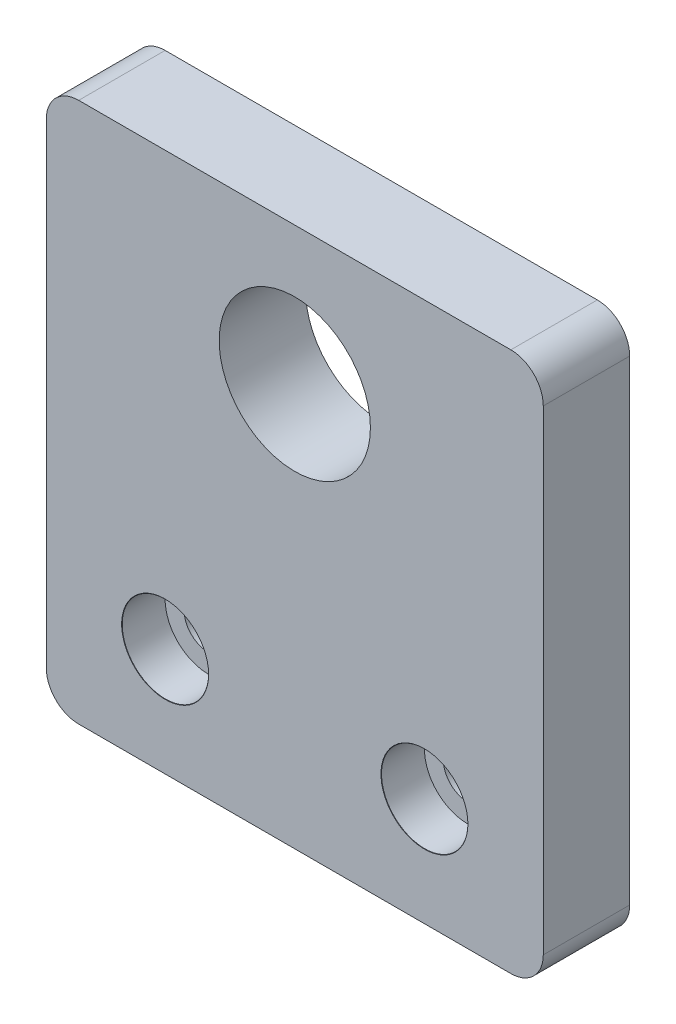
ISO-10303-21;
HEADER;
FILE_DESCRIPTION(('STEP AP214'),'2;1');
FILE_NAME('part.step','',(''),(''),'','','');
FILE_SCHEMA(('AUTOMOTIVE_DESIGN { 1 0 10303 214 1 1 1 1 }'));
ENDSEC;
DATA;
#1=APPLICATION_CONTEXT('core data for automotive mechanical design processes');
#2=APPLICATION_PROTOCOL_DEFINITION('international standard','automotive_design',2000,#1);
#3=PRODUCT_CONTEXT('',#1,'mechanical');
#4=PRODUCT('Part','Part','',(#3));
#5=PRODUCT_RELATED_PRODUCT_CATEGORY('part','',(#4));
#6=PRODUCT_DEFINITION_FORMATION('','',#4);
#7=PRODUCT_DEFINITION_CONTEXT('part definition',#1,'design');
#8=PRODUCT_DEFINITION('design','',#6,#7);
#9=PRODUCT_DEFINITION_SHAPE('','',#8);
#10=(LENGTH_UNIT() NAMED_UNIT(*) SI_UNIT(.MILLI.,.METRE.));
#11=(NAMED_UNIT(*) PLANE_ANGLE_UNIT() SI_UNIT($,.RADIAN.));
#12=(NAMED_UNIT(*) SI_UNIT($,.STERADIAN.) SOLID_ANGLE_UNIT());
#13=UNCERTAINTY_MEASURE_WITH_UNIT(LENGTH_MEASURE(1.E-05),#10,'distance_accuracy_value','');
#14=(GEOMETRIC_REPRESENTATION_CONTEXT(3) GLOBAL_UNCERTAINTY_ASSIGNED_CONTEXT((#13)) GLOBAL_UNIT_ASSIGNED_CONTEXT((#10,
#11,#12)) REPRESENTATION_CONTEXT('',''));
#15=CARTESIAN_POINT('',(0.,0.,0.));
#16=DIRECTION('',(0.,0.,1.));
#17=DIRECTION('',(1.,0.,0.));
#18=AXIS2_PLACEMENT_3D('',#15,#16,#17);
#19=CARTESIAN_POINT('',(0.,0.,8.));
#20=DIRECTION('',(0.,0.,-1.));
#21=DIRECTION('',(-1.,0.,0.));
#22=AXIS2_PLACEMENT_3D('',#19,#20,#21);
#23=PLANE('',#22);
#24=CARTESIAN_POINT('',(-12.,-15.,8.));
#25=DIRECTION('',(0.,0.,1.));
#26=DIRECTION('',(1.,0.,0.));
#27=AXIS2_PLACEMENT_3D('',#24,#25,#26);
#28=CIRCLE('',#27,4.025);
#29=CARTESIAN_POINT('',(-7.975,-15.,8.));
#30=VERTEX_POINT('',#29);
#31=EDGE_CURVE('E250',#30,#30,#28,.T.);
#32=ORIENTED_EDGE('',*,*,#31,.F.);
#33=EDGE_LOOP('',(#32));
#34=FACE_BOUND('',#33,.T.);
#35=CARTESIAN_POINT('',(12.,-15.,8.));
#36=DIRECTION('',(0.,0.,1.));
#37=DIRECTION('',(1.,0.,0.));
#38=AXIS2_PLACEMENT_3D('',#35,#36,#37);
#39=CIRCLE('',#38,4.025);
#40=CARTESIAN_POINT('',(16.025,-15.,8.));
#41=VERTEX_POINT('',#40);
#42=EDGE_CURVE('E230',#41,#41,#39,.T.);
#43=ORIENTED_EDGE('',*,*,#42,.F.);
#44=EDGE_LOOP('',(#43));
#45=FACE_BOUND('',#44,.T.);
#46=DIRECTION('',(1.,0.,0.));
#47=VECTOR('',#46,1.);
#48=CARTESIAN_POINT('',(-23.,-25.,8.));
#49=LINE('',#48,#47);
#50=CARTESIAN_POINT('',(-20.,-25.,8.));
#51=VERTEX_POINT('',#50);
#52=CARTESIAN_POINT('',(20.,-25.,8.));
#53=VERTEX_POINT('',#52);
#54=EDGE_CURVE('E148',#51,#53,#49,.T.);
#55=ORIENTED_EDGE('',*,*,#54,.T.);
#56=CARTESIAN_POINT('',(20.,-22.,8.));
#57=DIRECTION('',(0.,0.,-1.));
#58=DIRECTION('',(-1.,0.,0.));
#59=AXIS2_PLACEMENT_3D('',#56,#57,#58);
#60=CIRCLE('',#59,3.);
#61=CARTESIAN_POINT('',(23.,-22.,8.));
#62=VERTEX_POINT('',#61);
#63=EDGE_CURVE('E178',#53,#62,#60,.F.);
#64=ORIENTED_EDGE('',*,*,#63,.T.);
#65=DIRECTION('',(0.,1.,0.));
#66=VECTOR('',#65,1.);
#67=CARTESIAN_POINT('',(23.,-25.,8.));
#68=LINE('',#67,#66);
#69=CARTESIAN_POINT('',(23.,22.,8.));
#70=VERTEX_POINT('',#69);
#71=EDGE_CURVE('E127',#62,#70,#68,.T.);
#72=ORIENTED_EDGE('',*,*,#71,.T.);
#73=CARTESIAN_POINT('',(20.,22.,8.));
#74=DIRECTION('',(0.,0.,-1.));
#75=DIRECTION('',(-1.,0.,0.));
#76=AXIS2_PLACEMENT_3D('',#73,#74,#75);
#77=CIRCLE('',#76,3.);
#78=CARTESIAN_POINT('',(20.,25.,8.));
#79=VERTEX_POINT('',#78);
#80=EDGE_CURVE('E170',#70,#79,#77,.F.);
#81=ORIENTED_EDGE('',*,*,#80,.T.);
#82=DIRECTION('',(-1.,0.,0.));
#83=VECTOR('',#82,1.);
#84=CARTESIAN_POINT('',(-23.,25.,8.));
#85=LINE('',#84,#83);
#86=CARTESIAN_POINT('',(-20.,25.,8.));
#87=VERTEX_POINT('',#86);
#88=EDGE_CURVE('E193',#79,#87,#85,.T.);
#89=ORIENTED_EDGE('',*,*,#88,.T.);
#90=CARTESIAN_POINT('',(-20.,22.,8.));
#91=DIRECTION('',(0.,0.,-1.));
#92=DIRECTION('',(-1.,0.,0.));
#93=AXIS2_PLACEMENT_3D('',#90,#91,#92);
#94=CIRCLE('',#93,3.);
#95=CARTESIAN_POINT('',(-23.,22.,8.));
#96=VERTEX_POINT('',#95);
#97=EDGE_CURVE('E62',#87,#96,#94,.F.);
#98=ORIENTED_EDGE('',*,*,#97,.T.);
#99=DIRECTION('',(0.,-1.,0.));
#100=VECTOR('',#99,1.);
#101=CARTESIAN_POINT('',(-23.,-25.,8.));
#102=LINE('',#101,#100);
#103=CARTESIAN_POINT('',(-23.,-22.,8.));
#104=VERTEX_POINT('',#103);
#105=EDGE_CURVE('E201',#96,#104,#102,.T.);
#106=ORIENTED_EDGE('',*,*,#105,.T.);
#107=CARTESIAN_POINT('',(-20.,-22.,8.));
#108=DIRECTION('',(0.,0.,-1.));
#109=DIRECTION('',(-1.,0.,0.));
#110=AXIS2_PLACEMENT_3D('',#107,#108,#109);
#111=CIRCLE('',#110,3.);
#112=EDGE_CURVE('E175',#104,#51,#111,.F.);
#113=ORIENTED_EDGE('',*,*,#112,.T.);
#114=EDGE_LOOP('',(#55,#64,#72,#81,#89,#98,#106,#113));
#115=FACE_BOUND('',#114,.T.);
#116=CARTESIAN_POINT('',(0.,12.25,8.));
#117=DIRECTION('',(0.,0.,1.));
#118=DIRECTION('',(1.,0.,0.));
#119=AXIS2_PLACEMENT_3D('',#116,#117,#118);
#120=CIRCLE('',#119,7.);
#121=CARTESIAN_POINT('',(7.,12.25,8.));
#122=VERTEX_POINT('',#121);
#123=EDGE_CURVE('E137',#122,#122,#120,.T.);
#124=ORIENTED_EDGE('',*,*,#123,.F.);
#125=EDGE_LOOP('',(#124));
#126=FACE_BOUND('',#125,.T.);
#127=ADVANCED_FACE('F39',(#34,#45,#115,#126),#23,.F.);
#128=CARTESIAN_POINT('',(0.,0.,0.));
#129=DIRECTION('',(0.,0.,-1.));
#130=DIRECTION('',(-1.,0.,0.));
#131=AXIS2_PLACEMENT_3D('',#128,#129,#130);
#132=PLANE('',#131);
#133=CARTESIAN_POINT('',(-12.,-15.,0.));
#134=DIRECTION('',(0.,0.,1.));
#135=DIRECTION('',(1.,0.,0.));
#136=AXIS2_PLACEMENT_3D('',#133,#134,#135);
#137=CIRCLE('',#136,2.25);
#138=CARTESIAN_POINT('',(-9.75,-15.,0.));
#139=VERTEX_POINT('',#138);
#140=EDGE_CURVE('E234',#139,#139,#137,.T.);
#141=ORIENTED_EDGE('',*,*,#140,.T.);
#142=EDGE_LOOP('',(#141));
#143=FACE_BOUND('',#142,.T.);
#144=CARTESIAN_POINT('',(12.,-15.,0.));
#145=DIRECTION('',(0.,0.,1.));
#146=DIRECTION('',(1.,0.,0.));
#147=AXIS2_PLACEMENT_3D('',#144,#145,#146);
#148=CIRCLE('',#147,2.25);
#149=CARTESIAN_POINT('',(14.25,-15.,0.));
#150=VERTEX_POINT('',#149);
#151=EDGE_CURVE('E213',#150,#150,#148,.T.);
#152=ORIENTED_EDGE('',*,*,#151,.T.);
#153=EDGE_LOOP('',(#152));
#154=FACE_BOUND('',#153,.T.);
#155=DIRECTION('',(0.,1.,0.));
#156=VECTOR('',#155,1.);
#157=CARTESIAN_POINT('',(23.,-25.,0.));
#158=LINE('',#157,#156);
#159=CARTESIAN_POINT('',(23.,-22.,0.));
#160=VERTEX_POINT('',#159);
#161=CARTESIAN_POINT('',(23.,22.,0.));
#162=VERTEX_POINT('',#161);
#163=EDGE_CURVE('E124',#160,#162,#158,.T.);
#164=ORIENTED_EDGE('',*,*,#163,.F.);
#165=CARTESIAN_POINT('',(20.,-22.,0.));
#166=DIRECTION('',(0.,0.,-1.));
#167=DIRECTION('',(-1.,0.,0.));
#168=AXIS2_PLACEMENT_3D('',#165,#166,#167);
#169=CIRCLE('',#168,3.);
#170=CARTESIAN_POINT('',(20.,-25.,0.));
#171=VERTEX_POINT('',#170);
#172=EDGE_CURVE('E106',#160,#171,#169,.T.);
#173=ORIENTED_EDGE('',*,*,#172,.T.);
#174=DIRECTION('',(1.,0.,0.));
#175=VECTOR('',#174,1.);
#176=CARTESIAN_POINT('',(-23.,-25.,0.));
#177=LINE('',#176,#175);
#178=CARTESIAN_POINT('',(-20.,-25.,0.));
#179=VERTEX_POINT('',#178);
#180=EDGE_CURVE('E153',#179,#171,#177,.T.);
#181=ORIENTED_EDGE('',*,*,#180,.F.);
#182=CARTESIAN_POINT('',(-20.,-22.,0.));
#183=DIRECTION('',(0.,0.,-1.));
#184=DIRECTION('',(-1.,0.,0.));
#185=AXIS2_PLACEMENT_3D('',#182,#183,#184);
#186=CIRCLE('',#185,3.);
#187=CARTESIAN_POINT('',(-23.,-22.,0.));
#188=VERTEX_POINT('',#187);
#189=EDGE_CURVE('E118',#179,#188,#186,.T.);
#190=ORIENTED_EDGE('',*,*,#189,.T.);
#191=DIRECTION('',(0.,-1.,0.));
#192=VECTOR('',#191,1.);
#193=CARTESIAN_POINT('',(-23.,-25.,0.));
#194=LINE('',#193,#192);
#195=CARTESIAN_POINT('',(-23.,22.,0.));
#196=VERTEX_POINT('',#195);
#197=EDGE_CURVE('E142',#196,#188,#194,.T.);
#198=ORIENTED_EDGE('',*,*,#197,.F.);
#199=CARTESIAN_POINT('',(-20.,22.,0.));
#200=DIRECTION('',(0.,0.,-1.));
#201=DIRECTION('',(-1.,0.,0.));
#202=AXIS2_PLACEMENT_3D('',#199,#200,#201);
#203=CIRCLE('',#202,3.);
#204=CARTESIAN_POINT('',(-20.,25.,0.));
#205=VERTEX_POINT('',#204);
#206=EDGE_CURVE('E160',#196,#205,#203,.T.);
#207=ORIENTED_EDGE('',*,*,#206,.T.);
#208=DIRECTION('',(-1.,0.,0.));
#209=VECTOR('',#208,1.);
#210=CARTESIAN_POINT('',(-23.,25.,0.));
#211=LINE('',#210,#209);
#212=CARTESIAN_POINT('',(20.,25.,0.));
#213=VERTEX_POINT('',#212);
#214=EDGE_CURVE('E136',#213,#205,#211,.T.);
#215=ORIENTED_EDGE('',*,*,#214,.F.);
#216=CARTESIAN_POINT('',(20.,22.,0.));
#217=DIRECTION('',(0.,0.,-1.));
#218=DIRECTION('',(-1.,0.,0.));
#219=AXIS2_PLACEMENT_3D('',#216,#217,#218);
#220=CIRCLE('',#219,3.);
#221=EDGE_CURVE('E129',#213,#162,#220,.T.);
#222=ORIENTED_EDGE('',*,*,#221,.T.);
#223=EDGE_LOOP('',(#164,#173,#181,#190,#198,#207,#215,#222));
#224=FACE_BOUND('',#223,.T.);
#225=CARTESIAN_POINT('',(0.,12.25,0.));
#226=DIRECTION('',(0.,0.,1.));
#227=DIRECTION('',(1.,0.,0.));
#228=AXIS2_PLACEMENT_3D('',#225,#226,#227);
#229=CIRCLE('',#228,7.);
#230=CARTESIAN_POINT('',(7.,12.25,0.));
#231=VERTEX_POINT('',#230);
#232=EDGE_CURVE('E145',#231,#231,#229,.T.);
#233=ORIENTED_EDGE('',*,*,#232,.T.);
#234=EDGE_LOOP('',(#233));
#235=FACE_BOUND('',#234,.T.);
#236=ADVANCED_FACE('F132',(#143,#154,#224,#235),#132,.T.);
#237=CARTESIAN_POINT('',(23.,-25.,8.));
#238=DIRECTION('',(-1.,0.,0.));
#239=DIRECTION('',(0.,-1.,0.));
#240=AXIS2_PLACEMENT_3D('',#237,#238,#239);
#241=PLANE('',#240);
#242=ORIENTED_EDGE('',*,*,#71,.F.);
#243=DIRECTION('',(0.,0.,-1.));
#244=VECTOR('',#243,1.);
#245=CARTESIAN_POINT('',(23.,-22.,8.));
#246=LINE('',#245,#244);
#247=EDGE_CURVE('E110',#62,#160,#246,.T.);
#248=ORIENTED_EDGE('',*,*,#247,.T.);
#249=ORIENTED_EDGE('',*,*,#163,.T.);
#250=DIRECTION('',(0.,0.,-1.));
#251=VECTOR('',#250,1.);
#252=CARTESIAN_POINT('',(23.,22.,8.));
#253=LINE('',#252,#251);
#254=EDGE_CURVE('E130',#162,#70,#253,.F.);
#255=ORIENTED_EDGE('',*,*,#254,.T.);
#256=EDGE_LOOP('',(#242,#248,#249,#255));
#257=FACE_BOUND('',#256,.T.);
#258=ADVANCED_FACE('F123',(#257),#241,.F.);
#259=CARTESIAN_POINT('',(-23.,25.,8.));
#260=DIRECTION('',(0.,-1.,0.));
#261=DIRECTION('',(0.,0.,-1.));
#262=AXIS2_PLACEMENT_3D('',#259,#260,#261);
#263=PLANE('',#262);
#264=ORIENTED_EDGE('',*,*,#214,.T.);
#265=DIRECTION('',(0.,0.,-1.));
#266=VECTOR('',#265,1.);
#267=CARTESIAN_POINT('',(-20.,25.,8.));
#268=LINE('',#267,#266);
#269=EDGE_CURVE('E11',#205,#87,#268,.F.);
#270=ORIENTED_EDGE('',*,*,#269,.T.);
#271=ORIENTED_EDGE('',*,*,#88,.F.);
#272=DIRECTION('',(0.,0.,-1.));
#273=VECTOR('',#272,1.);
#274=CARTESIAN_POINT('',(20.,25.,8.));
#275=LINE('',#274,#273);
#276=EDGE_CURVE('E48',#79,#213,#275,.T.);
#277=ORIENTED_EDGE('',*,*,#276,.T.);
#278=EDGE_LOOP('',(#264,#270,#271,#277));
#279=FACE_BOUND('',#278,.T.);
#280=ADVANCED_FACE('F191',(#279),#263,.F.);
#281=CARTESIAN_POINT('',(-23.,-25.,8.));
#282=DIRECTION('',(1.,0.,0.));
#283=DIRECTION('',(0.,0.,-1.));
#284=AXIS2_PLACEMENT_3D('',#281,#282,#283);
#285=PLANE('',#284);
#286=ORIENTED_EDGE('',*,*,#197,.T.);
#287=DIRECTION('',(0.,0.,-1.));
#288=VECTOR('',#287,1.);
#289=CARTESIAN_POINT('',(-23.,-22.,8.));
#290=LINE('',#289,#288);
#291=EDGE_CURVE('E55',#188,#104,#290,.F.);
#292=ORIENTED_EDGE('',*,*,#291,.T.);
#293=ORIENTED_EDGE('',*,*,#105,.F.);
#294=DIRECTION('',(0.,0.,-1.));
#295=VECTOR('',#294,1.);
#296=CARTESIAN_POINT('',(-23.,22.,8.));
#297=LINE('',#296,#295);
#298=EDGE_CURVE('E181',#96,#196,#297,.T.);
#299=ORIENTED_EDGE('',*,*,#298,.T.);
#300=EDGE_LOOP('',(#286,#292,#293,#299));
#301=FACE_BOUND('',#300,.T.);
#302=ADVANCED_FACE('F200',(#301),#285,.F.);
#303=CARTESIAN_POINT('',(-23.,-25.,8.));
#304=DIRECTION('',(0.,1.,0.));
#305=DIRECTION('',(-1.,0.,0.));
#306=AXIS2_PLACEMENT_3D('',#303,#304,#305);
#307=PLANE('',#306);
#308=ORIENTED_EDGE('',*,*,#180,.T.);
#309=DIRECTION('',(0.,0.,-1.));
#310=VECTOR('',#309,1.);
#311=CARTESIAN_POINT('',(20.,-25.,8.));
#312=LINE('',#311,#310);
#313=EDGE_CURVE('E111',#171,#53,#312,.F.);
#314=ORIENTED_EDGE('',*,*,#313,.T.);
#315=ORIENTED_EDGE('',*,*,#54,.F.);
#316=DIRECTION('',(0.,0.,-1.));
#317=VECTOR('',#316,1.);
#318=CARTESIAN_POINT('',(-20.,-25.,8.));
#319=LINE('',#318,#317);
#320=EDGE_CURVE('E117',#51,#179,#319,.T.);
#321=ORIENTED_EDGE('',*,*,#320,.T.);
#322=EDGE_LOOP('',(#308,#314,#315,#321));
#323=FACE_BOUND('',#322,.T.);
#324=ADVANCED_FACE('F268',(#323),#307,.F.);
#325=CARTESIAN_POINT('',(0.,12.25,8.));
#326=DIRECTION('',(0.,0.,-1.));
#327=DIRECTION('',(-1.,0.,0.));
#328=AXIS2_PLACEMENT_3D('',#325,#326,#327);
#329=CYLINDRICAL_SURFACE('',#328,7.);
#330=ORIENTED_EDGE('',*,*,#123,.T.);
#331=EDGE_LOOP('',(#330));
#332=FACE_BOUND('',#331,.T.);
#333=ORIENTED_EDGE('',*,*,#232,.F.);
#334=EDGE_LOOP('',(#333));
#335=FACE_BOUND('',#334,.T.);
#336=ADVANCED_FACE('F265',(#332,#335),#329,.F.);
#337=CARTESIAN_POINT('',(20.,-22.,8.));
#338=DIRECTION('',(0.,0.,-1.));
#339=DIRECTION('',(-1.,0.,0.));
#340=AXIS2_PLACEMENT_3D('',#337,#338,#339);
#341=CYLINDRICAL_SURFACE('',#340,3.);
#342=ORIENTED_EDGE('',*,*,#63,.F.);
#343=ORIENTED_EDGE('',*,*,#313,.F.);
#344=ORIENTED_EDGE('',*,*,#172,.F.);
#345=ORIENTED_EDGE('',*,*,#247,.F.);
#346=EDGE_LOOP('',(#342,#343,#344,#345));
#347=FACE_BOUND('',#346,.T.);
#348=ADVANCED_FACE('F109',(#347),#341,.T.);
#349=CARTESIAN_POINT('',(-20.,-22.,8.));
#350=DIRECTION('',(0.,0.,-1.));
#351=DIRECTION('',(-1.,0.,0.));
#352=AXIS2_PLACEMENT_3D('',#349,#350,#351);
#353=CYLINDRICAL_SURFACE('',#352,3.);
#354=ORIENTED_EDGE('',*,*,#112,.F.);
#355=ORIENTED_EDGE('',*,*,#291,.F.);
#356=ORIENTED_EDGE('',*,*,#189,.F.);
#357=ORIENTED_EDGE('',*,*,#320,.F.);
#358=EDGE_LOOP('',(#354,#355,#356,#357));
#359=FACE_BOUND('',#358,.T.);
#360=ADVANCED_FACE('F289',(#359),#353,.T.);
#361=CARTESIAN_POINT('',(-20.,22.,8.));
#362=DIRECTION('',(0.,0.,-1.));
#363=DIRECTION('',(-1.,0.,0.));
#364=AXIS2_PLACEMENT_3D('',#361,#362,#363);
#365=CYLINDRICAL_SURFACE('',#364,3.);
#366=ORIENTED_EDGE('',*,*,#97,.F.);
#367=ORIENTED_EDGE('',*,*,#269,.F.);
#368=ORIENTED_EDGE('',*,*,#206,.F.);
#369=ORIENTED_EDGE('',*,*,#298,.F.);
#370=EDGE_LOOP('',(#366,#367,#368,#369));
#371=FACE_BOUND('',#370,.T.);
#372=ADVANCED_FACE('F199',(#371),#365,.T.);
#373=CARTESIAN_POINT('',(20.,22.,8.));
#374=DIRECTION('',(0.,0.,-1.));
#375=DIRECTION('',(-1.,0.,0.));
#376=AXIS2_PLACEMENT_3D('',#373,#374,#375);
#377=CYLINDRICAL_SURFACE('',#376,3.);
#378=ORIENTED_EDGE('',*,*,#80,.F.);
#379=ORIENTED_EDGE('',*,*,#254,.F.);
#380=ORIENTED_EDGE('',*,*,#221,.F.);
#381=ORIENTED_EDGE('',*,*,#276,.F.);
#382=EDGE_LOOP('',(#378,#379,#380,#381));
#383=FACE_BOUND('',#382,.T.);
#384=ADVANCED_FACE('F41',(#383),#377,.T.);
#385=CARTESIAN_POINT('',(12.,-15.,8.));
#386=DIRECTION('',(0.,0.,1.));
#387=DIRECTION('',(1.,0.,0.));
#388=AXIS2_PLACEMENT_3D('',#385,#386,#387);
#389=CYLINDRICAL_SURFACE('',#388,2.25);
#390=ORIENTED_EDGE('',*,*,#151,.F.);
#391=EDGE_LOOP('',(#390));
#392=FACE_BOUND('',#391,.T.);
#393=CARTESIAN_POINT('',(12.,-15.,4.));
#394=DIRECTION('',(0.,0.,1.));
#395=DIRECTION('',(1.,0.,0.));
#396=AXIS2_PLACEMENT_3D('',#393,#394,#395);
#397=CIRCLE('',#396,2.25);
#398=CARTESIAN_POINT('',(14.25,-15.,4.));
#399=VERTEX_POINT('',#398);
#400=EDGE_CURVE('E218',#399,#399,#397,.T.);
#401=ORIENTED_EDGE('',*,*,#400,.T.);
#402=EDGE_LOOP('',(#401));
#403=FACE_BOUND('',#402,.T.);
#404=ADVANCED_FACE('F296',(#392,#403),#389,.F.);
#405=CARTESIAN_POINT('',(16.,-15.,4.));
#406=DIRECTION('',(0.,0.,-1.));
#407=DIRECTION('',(-1.,0.,0.));
#408=AXIS2_PLACEMENT_3D('',#405,#406,#407);
#409=PLANE('',#408);
#410=ORIENTED_EDGE('',*,*,#400,.F.);
#411=EDGE_LOOP('',(#410));
#412=FACE_BOUND('',#411,.T.);
#413=CARTESIAN_POINT('',(12.,-15.,4.));
#414=DIRECTION('',(0.,0.,1.));
#415=DIRECTION('',(1.,0.,0.));
#416=AXIS2_PLACEMENT_3D('',#413,#414,#415);
#417=CIRCLE('',#416,4.);
#418=CARTESIAN_POINT('',(16.,-15.,4.));
#419=VERTEX_POINT('',#418);
#420=EDGE_CURVE('E222',#419,#419,#417,.T.);
#421=ORIENTED_EDGE('',*,*,#420,.T.);
#422=EDGE_LOOP('',(#421));
#423=FACE_BOUND('',#422,.T.);
#424=ADVANCED_FACE('F300',(#412,#423),#409,.F.);
#425=CARTESIAN_POINT('',(12.,-15.,8.));
#426=DIRECTION('',(0.,0.,1.));
#427=DIRECTION('',(1.,0.,0.));
#428=AXIS2_PLACEMENT_3D('',#425,#426,#427);
#429=CYLINDRICAL_SURFACE('',#428,4.);
#430=ORIENTED_EDGE('',*,*,#420,.F.);
#431=EDGE_LOOP('',(#430));
#432=FACE_BOUND('',#431,.T.);
#433=CARTESIAN_POINT('',(12.,-15.,7.975));
#434=DIRECTION('',(0.,0.,1.));
#435=DIRECTION('',(1.,0.,0.));
#436=AXIS2_PLACEMENT_3D('',#433,#434,#435);
#437=CIRCLE('',#436,4.);
#438=CARTESIAN_POINT('',(16.,-15.,7.975));
#439=VERTEX_POINT('',#438);
#440=EDGE_CURVE('E226',#439,#439,#437,.T.);
#441=ORIENTED_EDGE('',*,*,#440,.T.);
#442=EDGE_LOOP('',(#441));
#443=FACE_BOUND('',#442,.T.);
#444=ADVANCED_FACE('F306',(#432,#443),#429,.F.);
#445=CARTESIAN_POINT('',(12.,-15.,8.));
#446=DIRECTION('',(0.,0.,1.));
#447=DIRECTION('',(1.,0.,0.));
#448=AXIS2_PLACEMENT_3D('',#445,#446,#447);
#449=CONICAL_SURFACE('',#448,4.025,0.785398163397518);
#450=ORIENTED_EDGE('',*,*,#440,.F.);
#451=EDGE_LOOP('',(#450));
#452=FACE_BOUND('',#451,.T.);
#453=ORIENTED_EDGE('',*,*,#42,.T.);
#454=EDGE_LOOP('',(#453));
#455=FACE_BOUND('',#454,.T.);
#456=ADVANCED_FACE('F314',(#452,#455),#449,.F.);
#457=CARTESIAN_POINT('',(-12.,-15.,8.));
#458=DIRECTION('',(0.,0.,1.));
#459=DIRECTION('',(1.,0.,0.));
#460=AXIS2_PLACEMENT_3D('',#457,#458,#459);
#461=CYLINDRICAL_SURFACE('',#460,2.25);
#462=ORIENTED_EDGE('',*,*,#140,.F.);
#463=EDGE_LOOP('',(#462));
#464=FACE_BOUND('',#463,.T.);
#465=CARTESIAN_POINT('',(-12.,-15.,4.));
#466=DIRECTION('',(0.,0.,1.));
#467=DIRECTION('',(1.,0.,0.));
#468=AXIS2_PLACEMENT_3D('',#465,#466,#467);
#469=CIRCLE('',#468,2.25);
#470=CARTESIAN_POINT('',(-9.75,-15.,4.));
#471=VERTEX_POINT('',#470);
#472=EDGE_CURVE('E238',#471,#471,#469,.T.);
#473=ORIENTED_EDGE('',*,*,#472,.T.);
#474=EDGE_LOOP('',(#473));
#475=FACE_BOUND('',#474,.T.);
#476=ADVANCED_FACE('F318',(#464,#475),#461,.F.);
#477=CARTESIAN_POINT('',(-8.,-15.,4.));
#478=DIRECTION('',(0.,0.,-1.));
#479=DIRECTION('',(-1.,0.,0.));
#480=AXIS2_PLACEMENT_3D('',#477,#478,#479);
#481=PLANE('',#480);
#482=ORIENTED_EDGE('',*,*,#472,.F.);
#483=EDGE_LOOP('',(#482));
#484=FACE_BOUND('',#483,.T.);
#485=CARTESIAN_POINT('',(-12.,-15.,4.));
#486=DIRECTION('',(0.,0.,1.));
#487=DIRECTION('',(1.,0.,0.));
#488=AXIS2_PLACEMENT_3D('',#485,#486,#487);
#489=CIRCLE('',#488,4.);
#490=CARTESIAN_POINT('',(-8.,-15.,4.));
#491=VERTEX_POINT('',#490);
#492=EDGE_CURVE('E242',#491,#491,#489,.T.);
#493=ORIENTED_EDGE('',*,*,#492,.T.);
#494=EDGE_LOOP('',(#493));
#495=FACE_BOUND('',#494,.T.);
#496=ADVANCED_FACE('F322',(#484,#495),#481,.F.);
#497=CARTESIAN_POINT('',(-12.,-15.,8.));
#498=DIRECTION('',(0.,0.,1.));
#499=DIRECTION('',(1.,0.,0.));
#500=AXIS2_PLACEMENT_3D('',#497,#498,#499);
#501=CYLINDRICAL_SURFACE('',#500,4.);
#502=ORIENTED_EDGE('',*,*,#492,.F.);
#503=EDGE_LOOP('',(#502));
#504=FACE_BOUND('',#503,.T.);
#505=CARTESIAN_POINT('',(-12.,-15.,7.975));
#506=DIRECTION('',(0.,0.,1.));
#507=DIRECTION('',(1.,0.,0.));
#508=AXIS2_PLACEMENT_3D('',#505,#506,#507);
#509=CIRCLE('',#508,4.);
#510=CARTESIAN_POINT('',(-8.,-15.,7.975));
#511=VERTEX_POINT('',#510);
#512=EDGE_CURVE('E246',#511,#511,#509,.T.);
#513=ORIENTED_EDGE('',*,*,#512,.T.);
#514=EDGE_LOOP('',(#513));
#515=FACE_BOUND('',#514,.T.);
#516=ADVANCED_FACE('F326',(#504,#515),#501,.F.);
#517=CARTESIAN_POINT('',(-12.,-15.,8.));
#518=DIRECTION('',(0.,0.,1.));
#519=DIRECTION('',(1.,0.,0.));
#520=AXIS2_PLACEMENT_3D('',#517,#518,#519);
#521=CONICAL_SURFACE('',#520,4.025,0.785398163397483);
#522=ORIENTED_EDGE('',*,*,#512,.F.);
#523=EDGE_LOOP('',(#522));
#524=FACE_BOUND('',#523,.T.);
#525=ORIENTED_EDGE('',*,*,#31,.T.);
#526=EDGE_LOOP('',(#525));
#527=FACE_BOUND('',#526,.T.);
#528=ADVANCED_FACE('F255',(#524,#527),#521,.F.);
#529=CLOSED_SHELL('',(#127,#236,#258,#280,#302,#324,#336,#348,#360,#372,#384,#404,#424,#444,
#456,#476,#496,#516,#528));
#530=MANIFOLD_SOLID_BREP('B2',#529);
#531=ADVANCED_BREP_SHAPE_REPRESENTATION('',(#18,#530),#14);
#532=SHAPE_DEFINITION_REPRESENTATION(#9,#531);
ENDSEC;
END-ISO-10303-21;
